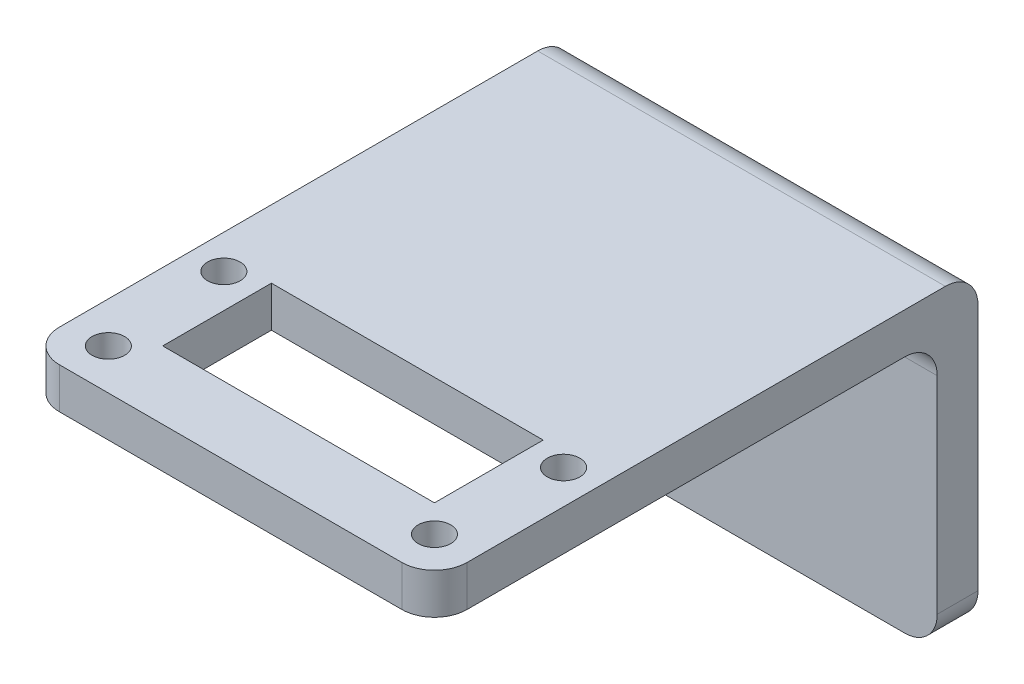
ISO-10303-21;
HEADER;
FILE_DESCRIPTION(('STEP AP214'),'2;1');
FILE_NAME('part.step','',(''),(''),'','','');
FILE_SCHEMA(('AUTOMOTIVE_DESIGN { 1 0 10303 214 1 1 1 1 }'));
ENDSEC;
DATA;
#1=APPLICATION_CONTEXT('core data for automotive mechanical design processes');
#2=APPLICATION_PROTOCOL_DEFINITION('international standard','automotive_design',2000,#1);
#3=PRODUCT_CONTEXT('',#1,'mechanical');
#4=PRODUCT('Part','Part','',(#3));
#5=PRODUCT_RELATED_PRODUCT_CATEGORY('part','',(#4));
#6=PRODUCT_DEFINITION_FORMATION('','',#4);
#7=PRODUCT_DEFINITION_CONTEXT('part definition',#1,'design');
#8=PRODUCT_DEFINITION('design','',#6,#7);
#9=PRODUCT_DEFINITION_SHAPE('','',#8);
#10=(LENGTH_UNIT() NAMED_UNIT(*) SI_UNIT(.MILLI.,.METRE.));
#11=(NAMED_UNIT(*) PLANE_ANGLE_UNIT() SI_UNIT($,.RADIAN.));
#12=(NAMED_UNIT(*) SI_UNIT($,.STERADIAN.) SOLID_ANGLE_UNIT());
#13=UNCERTAINTY_MEASURE_WITH_UNIT(LENGTH_MEASURE(1.E-05),#10,'distance_accuracy_value','');
#14=(GEOMETRIC_REPRESENTATION_CONTEXT(3) GLOBAL_UNCERTAINTY_ASSIGNED_CONTEXT((#13)) GLOBAL_UNIT_ASSIGNED_CONTEXT((#10,
#11,#12)) REPRESENTATION_CONTEXT('',''));
#15=CARTESIAN_POINT('',(0.,0.,0.));
#16=DIRECTION('',(0.,0.,1.));
#17=DIRECTION('',(1.,0.,0.));
#18=AXIS2_PLACEMENT_3D('',#15,#16,#17);
#19=CARTESIAN_POINT('',(0.,0.,0.));
#20=DIRECTION('',(0.,-1.,0.));
#21=DIRECTION('',(0.,0.,-1.));
#22=AXIS2_PLACEMENT_3D('',#19,#20,#21);
#23=PLANE('',#22);
#24=CARTESIAN_POINT('',(12.,0.,17.));
#25=DIRECTION('',(0.,-1.,0.));
#26=DIRECTION('',(0.,0.,-1.));
#27=AXIS2_PLACEMENT_3D('',#24,#25,#26);
#28=CIRCLE('',#27,1.2);
#29=CARTESIAN_POINT('',(12.,0.,15.8));
#30=VERTEX_POINT('',#29);
#31=EDGE_CURVE('E304',#30,#30,#28,.T.);
#32=ORIENTED_EDGE('',*,*,#31,.F.);
#33=EDGE_LOOP('',(#32));
#34=FACE_BOUND('',#33,.T.);
#35=CARTESIAN_POINT('',(-12.5,0.,8.));
#36=DIRECTION('',(0.,-1.,0.));
#37=DIRECTION('',(0.,0.,-1.));
#38=AXIS2_PLACEMENT_3D('',#35,#36,#37);
#39=CIRCLE('',#38,1.2);
#40=CARTESIAN_POINT('',(-12.5,0.,6.8));
#41=VERTEX_POINT('',#40);
#42=EDGE_CURVE('E298',#41,#41,#39,.T.);
#43=ORIENTED_EDGE('',*,*,#42,.F.);
#44=EDGE_LOOP('',(#43));
#45=FACE_BOUND('',#44,.T.);
#46=CARTESIAN_POINT('',(12.5,0.,8.));
#47=DIRECTION('',(0.,-1.,0.));
#48=DIRECTION('',(0.,0.,-1.));
#49=AXIS2_PLACEMENT_3D('',#46,#47,#48);
#50=CIRCLE('',#49,1.2);
#51=CARTESIAN_POINT('',(12.5,0.,6.8));
#52=VERTEX_POINT('',#51);
#53=EDGE_CURVE('E291',#52,#52,#50,.T.);
#54=ORIENTED_EDGE('',*,*,#53,.F.);
#55=EDGE_LOOP('',(#54));
#56=FACE_BOUND('',#55,.T.);
#57=CARTESIAN_POINT('',(-12.,0.,17.));
#58=DIRECTION('',(0.,-1.,0.));
#59=DIRECTION('',(0.,0.,-1.));
#60=AXIS2_PLACEMENT_3D('',#57,#58,#59);
#61=CIRCLE('',#60,1.2);
#62=CARTESIAN_POINT('',(-12.,0.,15.8));
#63=VERTEX_POINT('',#62);
#64=EDGE_CURVE('E183',#63,#63,#61,.T.);
#65=ORIENTED_EDGE('',*,*,#64,.F.);
#66=EDGE_LOOP('',(#65));
#67=FACE_BOUND('',#66,.T.);
#68=DIRECTION('',(0.,0.,-1.));
#69=VECTOR('',#68,1.);
#70=CARTESIAN_POINT('',(10.,0.,7.00000000000001));
#71=LINE('',#70,#69);
#72=CARTESIAN_POINT('',(10.,0.,15.));
#73=VERTEX_POINT('',#72);
#74=CARTESIAN_POINT('',(10.,0.,7.00000000000001));
#75=VERTEX_POINT('',#74);
#76=EDGE_CURVE('E157',#73,#75,#71,.T.);
#77=ORIENTED_EDGE('',*,*,#76,.T.);
#78=DIRECTION('',(-1.,0.,0.));
#79=VECTOR('',#78,1.);
#80=CARTESIAN_POINT('',(-10.,0.,7.00000000000001));
#81=LINE('',#80,#79);
#82=CARTESIAN_POINT('',(-10.,0.,7.00000000000001));
#83=VERTEX_POINT('',#82);
#84=EDGE_CURVE('E169',#75,#83,#81,.T.);
#85=ORIENTED_EDGE('',*,*,#84,.T.);
#86=DIRECTION('',(0.,0.,1.));
#87=VECTOR('',#86,1.);
#88=CARTESIAN_POINT('',(-10.,0.,15.));
#89=LINE('',#88,#87);
#90=CARTESIAN_POINT('',(-10.,0.,15.));
#91=VERTEX_POINT('',#90);
#92=EDGE_CURVE('E173',#83,#91,#89,.T.);
#93=ORIENTED_EDGE('',*,*,#92,.T.);
#94=DIRECTION('',(1.,0.,0.));
#95=VECTOR('',#94,1.);
#96=CARTESIAN_POINT('',(10.,0.,15.));
#97=LINE('',#96,#95);
#98=EDGE_CURVE('E165',#91,#73,#97,.T.);
#99=ORIENTED_EDGE('',*,*,#98,.T.);
#100=EDGE_LOOP('',(#77,#85,#93,#99));
#101=FACE_BOUND('',#100,.T.);
#102=DIRECTION('',(0.,0.,-1.));
#103=VECTOR('',#102,1.);
#104=CARTESIAN_POINT('',(15.,0.,20.));
#105=LINE('',#104,#103);
#106=CARTESIAN_POINT('',(15.,0.,17.6));
#107=VERTEX_POINT('',#106);
#108=CARTESIAN_POINT('',(15.,0.,-14.6));
#109=VERTEX_POINT('',#108);
#110=EDGE_CURVE('E196',#107,#109,#105,.T.);
#111=ORIENTED_EDGE('',*,*,#110,.F.);
#112=CARTESIAN_POINT('',(12.6,0.,17.6));
#113=DIRECTION('',(0.,-1.,0.));
#114=DIRECTION('',(0.,0.,-1.));
#115=AXIS2_PLACEMENT_3D('',#112,#113,#114);
#116=CIRCLE('',#115,2.4);
#117=CARTESIAN_POINT('',(12.6,0.,20.));
#118=VERTEX_POINT('',#117);
#119=EDGE_CURVE('E245',#107,#118,#116,.T.);
#120=ORIENTED_EDGE('',*,*,#119,.T.);
#121=DIRECTION('',(1.,0.,0.));
#122=VECTOR('',#121,1.);
#123=CARTESIAN_POINT('',(-15.,0.,20.));
#124=LINE('',#123,#122);
#125=CARTESIAN_POINT('',(-12.6,0.,20.));
#126=VERTEX_POINT('',#125);
#127=EDGE_CURVE('E203',#126,#118,#124,.T.);
#128=ORIENTED_EDGE('',*,*,#127,.F.);
#129=CARTESIAN_POINT('',(-12.6,0.,17.6));
#130=DIRECTION('',(0.,-1.,0.));
#131=DIRECTION('',(0.,0.,-1.));
#132=AXIS2_PLACEMENT_3D('',#129,#130,#131);
#133=CIRCLE('',#132,2.4);
#134=CARTESIAN_POINT('',(-15.,0.,17.6));
#135=VERTEX_POINT('',#134);
#136=EDGE_CURVE('E243',#126,#135,#133,.T.);
#137=ORIENTED_EDGE('',*,*,#136,.T.);
#138=DIRECTION('',(0.,0.,1.));
#139=VECTOR('',#138,1.);
#140=CARTESIAN_POINT('',(-15.,0.,-20.));
#141=LINE('',#140,#139);
#142=CARTESIAN_POINT('',(-15.,0.,-14.6));
#143=VERTEX_POINT('',#142);
#144=EDGE_CURVE('E211',#143,#135,#141,.T.);
#145=ORIENTED_EDGE('',*,*,#144,.F.);
#146=DIRECTION('',(1.,0.,0.));
#147=VECTOR('',#146,1.);
#148=CARTESIAN_POINT('',(15.,0.,-14.6));
#149=LINE('',#148,#147);
#150=EDGE_CURVE('E219',#143,#109,#149,.T.);
#151=ORIENTED_EDGE('',*,*,#150,.T.);
#152=EDGE_LOOP('',(#111,#120,#128,#137,#145,#151));
#153=FACE_BOUND('',#152,.T.);
#154=ADVANCED_FACE('F38',(#34,#45,#56,#67,#101,#153),#23,.T.);
#155=CARTESIAN_POINT('',(15.,3.,20.));
#156=DIRECTION('',(-1.,0.,0.));
#157=DIRECTION('',(0.,0.,1.));
#158=AXIS2_PLACEMENT_3D('',#155,#156,#157);
#159=PLANE('',#158);
#160=DIRECTION('',(0.,1.,0.));
#161=VECTOR('',#160,1.);
#162=CARTESIAN_POINT('',(15.,-20.,-17.));
#163=LINE('',#162,#161);
#164=CARTESIAN_POINT('',(15.,-17.6,-17.));
#165=VERTEX_POINT('',#164);
#166=CARTESIAN_POINT('',(15.,-2.4,-17.));
#167=VERTEX_POINT('',#166);
#168=EDGE_CURVE('E280',#165,#167,#163,.T.);
#169=ORIENTED_EDGE('',*,*,#168,.F.);
#170=DIRECTION('',(0.,0.,1.));
#171=VECTOR('',#170,1.);
#172=CARTESIAN_POINT('',(15.,-17.6,-20.));
#173=LINE('',#172,#171);
#174=CARTESIAN_POINT('',(15.,-17.6,-20.));
#175=VERTEX_POINT('',#174);
#176=EDGE_CURVE('E61',#165,#175,#173,.F.);
#177=ORIENTED_EDGE('',*,*,#176,.T.);
#178=DIRECTION('',(0.,-1.,0.));
#179=VECTOR('',#178,1.);
#180=CARTESIAN_POINT('',(15.,3.,-20.));
#181=LINE('',#180,#179);
#182=CARTESIAN_POINT('',(15.,0.6,-20.));
#183=VERTEX_POINT('',#182);
#184=EDGE_CURVE('E217',#183,#175,#181,.T.);
#185=ORIENTED_EDGE('',*,*,#184,.F.);
#186=CARTESIAN_POINT('',(15.,0.6,-17.6));
#187=DIRECTION('',(-1.,0.,0.));
#188=DIRECTION('',(0.,0.,1.));
#189=AXIS2_PLACEMENT_3D('',#186,#187,#188);
#190=CIRCLE('',#189,2.4);
#191=CARTESIAN_POINT('',(15.,3.,-17.6));
#192=VERTEX_POINT('',#191);
#193=EDGE_CURVE('E237',#183,#192,#190,.F.);
#194=ORIENTED_EDGE('',*,*,#193,.T.);
#195=DIRECTION('',(0.,0.,-1.));
#196=VECTOR('',#195,1.);
#197=CARTESIAN_POINT('',(15.,3.,20.));
#198=LINE('',#197,#196);
#199=CARTESIAN_POINT('',(15.,3.,17.6));
#200=VERTEX_POINT('',#199);
#201=EDGE_CURVE('E200',#200,#192,#198,.T.);
#202=ORIENTED_EDGE('',*,*,#201,.F.);
#203=DIRECTION('',(0.,-1.,0.));
#204=VECTOR('',#203,1.);
#205=CARTESIAN_POINT('',(15.,3.,17.6));
#206=LINE('',#205,#204);
#207=EDGE_CURVE('E240',#200,#107,#206,.T.);
#208=ORIENTED_EDGE('',*,*,#207,.T.);
#209=ORIENTED_EDGE('',*,*,#110,.T.);
#210=CARTESIAN_POINT('',(15.,-2.4,-14.6));
#211=DIRECTION('',(-1.,0.,0.));
#212=DIRECTION('',(0.,0.,1.));
#213=AXIS2_PLACEMENT_3D('',#210,#211,#212);
#214=CIRCLE('',#213,2.4);
#215=EDGE_CURVE('E225',#109,#167,#214,.T.);
#216=ORIENTED_EDGE('',*,*,#215,.T.);
#217=EDGE_LOOP('',(#169,#177,#185,#194,#202,#208,#209,#216));
#218=FACE_BOUND('',#217,.T.);
#219=ADVANCED_FACE('F286',(#218),#159,.F.);
#220=CARTESIAN_POINT('',(-15.,3.,-20.));
#221=DIRECTION('',(0.,0.,1.));
#222=DIRECTION('',(1.,0.,0.));
#223=AXIS2_PLACEMENT_3D('',#220,#221,#222);
#224=PLANE('',#223);
#225=ORIENTED_EDGE('',*,*,#184,.T.);
#226=CARTESIAN_POINT('',(12.6,-17.6,-20.));
#227=DIRECTION('',(0.,0.,1.));
#228=DIRECTION('',(1.,0.,0.));
#229=AXIS2_PLACEMENT_3D('',#226,#227,#228);
#230=CIRCLE('',#229,2.4);
#231=CARTESIAN_POINT('',(12.6,-20.,-20.));
#232=VERTEX_POINT('',#231);
#233=EDGE_CURVE('E46',#175,#232,#230,.F.);
#234=ORIENTED_EDGE('',*,*,#233,.T.);
#235=DIRECTION('',(1.,0.,0.));
#236=VECTOR('',#235,1.);
#237=CARTESIAN_POINT('',(0.,-20.,-20.));
#238=LINE('',#237,#236);
#239=CARTESIAN_POINT('',(-12.6,-20.,-20.));
#240=VERTEX_POINT('',#239);
#241=EDGE_CURVE('E272',#240,#232,#238,.T.);
#242=ORIENTED_EDGE('',*,*,#241,.F.);
#243=CARTESIAN_POINT('',(-12.6,-17.6,-20.));
#244=DIRECTION('',(0.,0.,1.));
#245=DIRECTION('',(1.,0.,0.));
#246=AXIS2_PLACEMENT_3D('',#243,#244,#245);
#247=CIRCLE('',#246,2.4);
#248=CARTESIAN_POINT('',(-15.,-17.6,-20.));
#249=VERTEX_POINT('',#248);
#250=EDGE_CURVE('E53',#240,#249,#247,.F.);
#251=ORIENTED_EDGE('',*,*,#250,.T.);
#252=DIRECTION('',(0.,-1.,0.));
#253=VECTOR('',#252,1.);
#254=CARTESIAN_POINT('',(-15.,3.,-20.));
#255=LINE('',#254,#253);
#256=CARTESIAN_POINT('',(-15.,0.6,-20.));
#257=VERTEX_POINT('',#256);
#258=EDGE_CURVE('E209',#257,#249,#255,.T.);
#259=ORIENTED_EDGE('',*,*,#258,.F.);
#260=DIRECTION('',(-1.,0.,0.));
#261=VECTOR('',#260,1.);
#262=CARTESIAN_POINT('',(-15.,0.6,-20.));
#263=LINE('',#262,#261);
#264=EDGE_CURVE('E235',#257,#183,#263,.F.);
#265=ORIENTED_EDGE('',*,*,#264,.T.);
#266=EDGE_LOOP('',(#225,#234,#242,#251,#259,#265));
#267=FACE_BOUND('',#266,.T.);
#268=ADVANCED_FACE('F271',(#267),#224,.F.);
#269=CARTESIAN_POINT('',(-15.,3.,-20.));
#270=DIRECTION('',(1.,0.,0.));
#271=DIRECTION('',(0.,0.,-1.));
#272=AXIS2_PLACEMENT_3D('',#269,#270,#271);
#273=PLANE('',#272);
#274=ORIENTED_EDGE('',*,*,#258,.T.);
#275=DIRECTION('',(0.,0.,-1.));
#276=VECTOR('',#275,1.);
#277=CARTESIAN_POINT('',(-15.,-17.6,-17.));
#278=LINE('',#277,#276);
#279=CARTESIAN_POINT('',(-15.,-17.6,-17.));
#280=VERTEX_POINT('',#279);
#281=EDGE_CURVE('E11',#249,#280,#278,.F.);
#282=ORIENTED_EDGE('',*,*,#281,.T.);
#283=DIRECTION('',(0.,1.,0.));
#284=VECTOR('',#283,1.);
#285=CARTESIAN_POINT('',(-15.,-20.,-17.));
#286=LINE('',#285,#284);
#287=CARTESIAN_POINT('',(-15.,-2.4,-17.));
#288=VERTEX_POINT('',#287);
#289=EDGE_CURVE('E289',#280,#288,#286,.T.);
#290=ORIENTED_EDGE('',*,*,#289,.T.);
#291=CARTESIAN_POINT('',(-15.,-2.4,-14.6));
#292=DIRECTION('',(1.,0.,0.));
#293=DIRECTION('',(0.,0.,-1.));
#294=AXIS2_PLACEMENT_3D('',#291,#292,#293);
#295=CIRCLE('',#294,2.4);
#296=EDGE_CURVE('E228',#288,#143,#295,.T.);
#297=ORIENTED_EDGE('',*,*,#296,.T.);
#298=ORIENTED_EDGE('',*,*,#144,.T.);
#299=DIRECTION('',(0.,-1.,0.));
#300=VECTOR('',#299,1.);
#301=CARTESIAN_POINT('',(-15.,3.,17.6));
#302=LINE('',#301,#300);
#303=CARTESIAN_POINT('',(-15.,3.,17.6));
#304=VERTEX_POINT('',#303);
#305=EDGE_CURVE('E256',#135,#304,#302,.F.);
#306=ORIENTED_EDGE('',*,*,#305,.T.);
#307=DIRECTION('',(0.,0.,1.));
#308=VECTOR('',#307,1.);
#309=CARTESIAN_POINT('',(-15.,3.,-20.));
#310=LINE('',#309,#308);
#311=CARTESIAN_POINT('',(-15.,3.,-17.6));
#312=VERTEX_POINT('',#311);
#313=EDGE_CURVE('E202',#312,#304,#310,.T.);
#314=ORIENTED_EDGE('',*,*,#313,.F.);
#315=CARTESIAN_POINT('',(-15.,0.6,-17.6));
#316=DIRECTION('',(1.,0.,0.));
#317=DIRECTION('',(0.,0.,-1.));
#318=AXIS2_PLACEMENT_3D('',#315,#316,#317);
#319=CIRCLE('',#318,2.4);
#320=EDGE_CURVE('E233',#312,#257,#319,.F.);
#321=ORIENTED_EDGE('',*,*,#320,.T.);
#322=EDGE_LOOP('',(#274,#282,#290,#297,#298,#306,#314,#321));
#323=FACE_BOUND('',#322,.T.);
#324=ADVANCED_FACE('F335',(#323),#273,.F.);
#325=CARTESIAN_POINT('',(-15.,3.,20.));
#326=DIRECTION('',(0.,0.,-1.));
#327=DIRECTION('',(-1.,0.,0.));
#328=AXIS2_PLACEMENT_3D('',#325,#326,#327);
#329=PLANE('',#328);
#330=ORIENTED_EDGE('',*,*,#127,.T.);
#331=DIRECTION('',(0.,-1.,0.));
#332=VECTOR('',#331,1.);
#333=CARTESIAN_POINT('',(12.6,3.,20.));
#334=LINE('',#333,#332);
#335=CARTESIAN_POINT('',(12.6,3.,20.));
#336=VERTEX_POINT('',#335);
#337=EDGE_CURVE('E250',#118,#336,#334,.F.);
#338=ORIENTED_EDGE('',*,*,#337,.T.);
#339=DIRECTION('',(1.,0.,0.));
#340=VECTOR('',#339,1.);
#341=CARTESIAN_POINT('',(-15.,3.,20.));
#342=LINE('',#341,#340);
#343=CARTESIAN_POINT('',(-12.6,3.,20.));
#344=VERTEX_POINT('',#343);
#345=EDGE_CURVE('E206',#344,#336,#342,.T.);
#346=ORIENTED_EDGE('',*,*,#345,.F.);
#347=DIRECTION('',(0.,-1.,0.));
#348=VECTOR('',#347,1.);
#349=CARTESIAN_POINT('',(-12.6,3.,20.));
#350=LINE('',#349,#348);
#351=EDGE_CURVE('E247',#344,#126,#350,.T.);
#352=ORIENTED_EDGE('',*,*,#351,.T.);
#353=EDGE_LOOP('',(#330,#338,#346,#352));
#354=FACE_BOUND('',#353,.T.);
#355=ADVANCED_FACE('F332',(#354),#329,.F.);
#356=CARTESIAN_POINT('',(0.,3.,0.));
#357=DIRECTION('',(0.,-1.,0.));
#358=DIRECTION('',(0.,0.,-1.));
#359=AXIS2_PLACEMENT_3D('',#356,#357,#358);
#360=PLANE('',#359);
#361=CARTESIAN_POINT('',(12.,3.,17.));
#362=DIRECTION('',(0.,-1.,0.));
#363=DIRECTION('',(0.,0.,-1.));
#364=AXIS2_PLACEMENT_3D('',#361,#362,#363);
#365=CIRCLE('',#364,1.2);
#366=CARTESIAN_POINT('',(12.,3.,15.8));
#367=VERTEX_POINT('',#366);
#368=EDGE_CURVE('E301',#367,#367,#365,.T.);
#369=ORIENTED_EDGE('',*,*,#368,.T.);
#370=EDGE_LOOP('',(#369));
#371=FACE_BOUND('',#370,.T.);
#372=CARTESIAN_POINT('',(-12.5,3.,8.));
#373=DIRECTION('',(0.,-1.,0.));
#374=DIRECTION('',(0.,0.,-1.));
#375=AXIS2_PLACEMENT_3D('',#372,#373,#374);
#376=CIRCLE('',#375,1.2);
#377=CARTESIAN_POINT('',(-12.5,3.,6.8));
#378=VERTEX_POINT('',#377);
#379=EDGE_CURVE('E307',#378,#378,#376,.T.);
#380=ORIENTED_EDGE('',*,*,#379,.T.);
#381=EDGE_LOOP('',(#380));
#382=FACE_BOUND('',#381,.T.);
#383=CARTESIAN_POINT('',(12.5,3.,8.));
#384=DIRECTION('',(0.,-1.,0.));
#385=DIRECTION('',(0.,0.,-1.));
#386=AXIS2_PLACEMENT_3D('',#383,#384,#385);
#387=CIRCLE('',#386,1.2);
#388=CARTESIAN_POINT('',(12.5,3.,6.8));
#389=VERTEX_POINT('',#388);
#390=EDGE_CURVE('E295',#389,#389,#387,.T.);
#391=ORIENTED_EDGE('',*,*,#390,.T.);
#392=EDGE_LOOP('',(#391));
#393=FACE_BOUND('',#392,.T.);
#394=CARTESIAN_POINT('',(-12.,3.,17.));
#395=DIRECTION('',(0.,-1.,0.));
#396=DIRECTION('',(0.,0.,-1.));
#397=AXIS2_PLACEMENT_3D('',#394,#395,#396);
#398=CIRCLE('',#397,1.2);
#399=CARTESIAN_POINT('',(-12.,3.,15.8));
#400=VERTEX_POINT('',#399);
#401=EDGE_CURVE('E190',#400,#400,#398,.T.);
#402=ORIENTED_EDGE('',*,*,#401,.T.);
#403=EDGE_LOOP('',(#402));
#404=FACE_BOUND('',#403,.T.);
#405=DIRECTION('',(-1.,0.,0.));
#406=VECTOR('',#405,1.);
#407=CARTESIAN_POINT('',(-10.,3.,7.00000000000001));
#408=LINE('',#407,#406);
#409=CARTESIAN_POINT('',(10.,3.,7.00000000000001));
#410=VERTEX_POINT('',#409);
#411=CARTESIAN_POINT('',(-10.,3.,7.00000000000001));
#412=VERTEX_POINT('',#411);
#413=EDGE_CURVE('E189',#410,#412,#408,.T.);
#414=ORIENTED_EDGE('',*,*,#413,.F.);
#415=DIRECTION('',(0.,0.,-1.));
#416=VECTOR('',#415,1.);
#417=CARTESIAN_POINT('',(10.,3.,7.00000000000001));
#418=LINE('',#417,#416);
#419=CARTESIAN_POINT('',(10.,3.,15.));
#420=VERTEX_POINT('',#419);
#421=EDGE_CURVE('E160',#420,#410,#418,.T.);
#422=ORIENTED_EDGE('',*,*,#421,.F.);
#423=DIRECTION('',(1.,0.,0.));
#424=VECTOR('',#423,1.);
#425=CARTESIAN_POINT('',(10.,3.,15.));
#426=LINE('',#425,#424);
#427=CARTESIAN_POINT('',(-10.,3.,15.));
#428=VERTEX_POINT('',#427);
#429=EDGE_CURVE('E177',#428,#420,#426,.T.);
#430=ORIENTED_EDGE('',*,*,#429,.F.);
#431=DIRECTION('',(0.,0.,1.));
#432=VECTOR('',#431,1.);
#433=CARTESIAN_POINT('',(-10.,3.,15.));
#434=LINE('',#433,#432);
#435=EDGE_CURVE('E180',#412,#428,#434,.T.);
#436=ORIENTED_EDGE('',*,*,#435,.F.);
#437=EDGE_LOOP('',(#414,#422,#430,#436));
#438=FACE_BOUND('',#437,.T.);
#439=ORIENTED_EDGE('',*,*,#345,.T.);
#440=CARTESIAN_POINT('',(12.6,3.,17.6));
#441=DIRECTION('',(0.,-1.,0.));
#442=DIRECTION('',(0.,0.,-1.));
#443=AXIS2_PLACEMENT_3D('',#440,#441,#442);
#444=CIRCLE('',#443,2.4);
#445=EDGE_CURVE('E254',#336,#200,#444,.F.);
#446=ORIENTED_EDGE('',*,*,#445,.T.);
#447=ORIENTED_EDGE('',*,*,#201,.T.);
#448=DIRECTION('',(-1.,0.,0.));
#449=VECTOR('',#448,1.);
#450=CARTESIAN_POINT('',(0.,3.,-17.6));
#451=LINE('',#450,#449);
#452=EDGE_CURVE('E230',#192,#312,#451,.T.);
#453=ORIENTED_EDGE('',*,*,#452,.T.);
#454=ORIENTED_EDGE('',*,*,#313,.T.);
#455=CARTESIAN_POINT('',(-12.6,3.,17.6));
#456=DIRECTION('',(0.,-1.,0.));
#457=DIRECTION('',(0.,0.,-1.));
#458=AXIS2_PLACEMENT_3D('',#455,#456,#457);
#459=CIRCLE('',#458,2.4);
#460=EDGE_CURVE('E252',#304,#344,#459,.F.);
#461=ORIENTED_EDGE('',*,*,#460,.T.);
#462=EDGE_LOOP('',(#439,#446,#447,#453,#454,#461));
#463=FACE_BOUND('',#462,.T.);
#464=ADVANCED_FACE('F330',(#371,#382,#393,#404,#438,#463),#360,.F.);
#465=CARTESIAN_POINT('',(10.,0.,7.00000000000001));
#466=DIRECTION('',(1.,0.,0.));
#467=DIRECTION('',(0.,0.,-1.));
#468=AXIS2_PLACEMENT_3D('',#465,#466,#467);
#469=PLANE('',#468);
#470=ORIENTED_EDGE('',*,*,#421,.T.);
#471=DIRECTION('',(0.,1.,0.));
#472=VECTOR('',#471,1.);
#473=CARTESIAN_POINT('',(10.,0.,7.00000000000001));
#474=LINE('',#473,#472);
#475=EDGE_CURVE('E153',#75,#410,#474,.T.);
#476=ORIENTED_EDGE('',*,*,#475,.F.);
#477=ORIENTED_EDGE('',*,*,#76,.F.);
#478=DIRECTION('',(0.,1.,0.));
#479=VECTOR('',#478,1.);
#480=CARTESIAN_POINT('',(10.,0.,15.));
#481=LINE('',#480,#479);
#482=EDGE_CURVE('E194',#73,#420,#481,.T.);
#483=ORIENTED_EDGE('',*,*,#482,.T.);
#484=EDGE_LOOP('',(#470,#476,#477,#483));
#485=FACE_BOUND('',#484,.T.);
#486=ADVANCED_FACE('F155',(#485),#469,.F.);
#487=CARTESIAN_POINT('',(10.,0.,15.));
#488=DIRECTION('',(0.,0.,1.));
#489=DIRECTION('',(1.,0.,0.));
#490=AXIS2_PLACEMENT_3D('',#487,#488,#489);
#491=PLANE('',#490);
#492=ORIENTED_EDGE('',*,*,#429,.T.);
#493=ORIENTED_EDGE('',*,*,#482,.F.);
#494=ORIENTED_EDGE('',*,*,#98,.F.);
#495=DIRECTION('',(0.,1.,0.));
#496=VECTOR('',#495,1.);
#497=CARTESIAN_POINT('',(-10.,0.,15.));
#498=LINE('',#497,#496);
#499=EDGE_CURVE('E197',#91,#428,#498,.T.);
#500=ORIENTED_EDGE('',*,*,#499,.T.);
#501=EDGE_LOOP('',(#492,#493,#494,#500));
#502=FACE_BOUND('',#501,.T.);
#503=ADVANCED_FACE('F390',(#502),#491,.F.);
#504=CARTESIAN_POINT('',(-10.,0.,15.));
#505=DIRECTION('',(-1.,0.,0.));
#506=DIRECTION('',(0.,0.,1.));
#507=AXIS2_PLACEMENT_3D('',#504,#505,#506);
#508=PLANE('',#507);
#509=ORIENTED_EDGE('',*,*,#435,.T.);
#510=ORIENTED_EDGE('',*,*,#499,.F.);
#511=ORIENTED_EDGE('',*,*,#92,.F.);
#512=DIRECTION('',(0.,1.,0.));
#513=VECTOR('',#512,1.);
#514=CARTESIAN_POINT('',(-10.,0.,7.00000000000001));
#515=LINE('',#514,#513);
#516=EDGE_CURVE('E164',#83,#412,#515,.T.);
#517=ORIENTED_EDGE('',*,*,#516,.T.);
#518=EDGE_LOOP('',(#509,#510,#511,#517));
#519=FACE_BOUND('',#518,.T.);
#520=ADVANCED_FACE('F400',(#519),#508,.F.);
#521=CARTESIAN_POINT('',(-10.,0.,7.00000000000001));
#522=DIRECTION('',(0.,0.,-1.));
#523=DIRECTION('',(-1.,0.,0.));
#524=AXIS2_PLACEMENT_3D('',#521,#522,#523);
#525=PLANE('',#524);
#526=ORIENTED_EDGE('',*,*,#413,.T.);
#527=ORIENTED_EDGE('',*,*,#516,.F.);
#528=ORIENTED_EDGE('',*,*,#84,.F.);
#529=ORIENTED_EDGE('',*,*,#475,.T.);
#530=EDGE_LOOP('',(#526,#527,#528,#529));
#531=FACE_BOUND('',#530,.T.);
#532=ADVANCED_FACE('F170',(#531),#525,.F.);
#533=CARTESIAN_POINT('',(-12.,3.,17.));
#534=DIRECTION('',(0.,-1.,0.));
#535=DIRECTION('',(0.,0.,-1.));
#536=AXIS2_PLACEMENT_3D('',#533,#534,#535);
#537=CYLINDRICAL_SURFACE('',#536,1.2);
#538=ORIENTED_EDGE('',*,*,#401,.F.);
#539=EDGE_LOOP('',(#538));
#540=FACE_BOUND('',#539,.T.);
#541=ORIENTED_EDGE('',*,*,#64,.T.);
#542=EDGE_LOOP('',(#541));
#543=FACE_BOUND('',#542,.T.);
#544=ADVANCED_FACE('F317',(#540,#543),#537,.F.);
#545=CARTESIAN_POINT('',(12.5,3.,8.));
#546=DIRECTION('',(0.,-1.,0.));
#547=DIRECTION('',(0.,0.,-1.));
#548=AXIS2_PLACEMENT_3D('',#545,#546,#547);
#549=CYLINDRICAL_SURFACE('',#548,1.2);
#550=ORIENTED_EDGE('',*,*,#390,.F.);
#551=EDGE_LOOP('',(#550));
#552=FACE_BOUND('',#551,.T.);
#553=ORIENTED_EDGE('',*,*,#53,.T.);
#554=EDGE_LOOP('',(#553));
#555=FACE_BOUND('',#554,.T.);
#556=ADVANCED_FACE('F415',(#552,#555),#549,.F.);
#557=CARTESIAN_POINT('',(-12.5,3.,8.));
#558=DIRECTION('',(0.,-1.,0.));
#559=DIRECTION('',(0.,0.,-1.));
#560=AXIS2_PLACEMENT_3D('',#557,#558,#559);
#561=CYLINDRICAL_SURFACE('',#560,1.2);
#562=ORIENTED_EDGE('',*,*,#379,.F.);
#563=EDGE_LOOP('',(#562));
#564=FACE_BOUND('',#563,.T.);
#565=ORIENTED_EDGE('',*,*,#42,.T.);
#566=EDGE_LOOP('',(#565));
#567=FACE_BOUND('',#566,.T.);
#568=ADVANCED_FACE('F420',(#564,#567),#561,.F.);
#569=CARTESIAN_POINT('',(12.,3.,17.));
#570=DIRECTION('',(0.,-1.,0.));
#571=DIRECTION('',(0.,0.,-1.));
#572=AXIS2_PLACEMENT_3D('',#569,#570,#571);
#573=CYLINDRICAL_SURFACE('',#572,1.2);
#574=ORIENTED_EDGE('',*,*,#368,.F.);
#575=EDGE_LOOP('',(#574));
#576=FACE_BOUND('',#575,.T.);
#577=ORIENTED_EDGE('',*,*,#31,.T.);
#578=EDGE_LOOP('',(#577));
#579=FACE_BOUND('',#578,.T.);
#580=ADVANCED_FACE('F426',(#576,#579),#573,.F.);
#581=CARTESIAN_POINT('',(0.,-20.,-17.));
#582=DIRECTION('',(0.,0.,1.));
#583=DIRECTION('',(1.,0.,0.));
#584=AXIS2_PLACEMENT_3D('',#581,#582,#583);
#585=PLANE('',#584);
#586=DIRECTION('',(1.,0.,0.));
#587=VECTOR('',#586,1.);
#588=CARTESIAN_POINT('',(0.,-20.,-17.));
#589=LINE('',#588,#587);
#590=CARTESIAN_POINT('',(-12.6,-20.,-17.));
#591=VERTEX_POINT('',#590);
#592=CARTESIAN_POINT('',(12.6,-20.,-17.));
#593=VERTEX_POINT('',#592);
#594=EDGE_CURVE('E281',#591,#593,#589,.T.);
#595=ORIENTED_EDGE('',*,*,#594,.T.);
#596=CARTESIAN_POINT('',(12.6,-17.6,-17.));
#597=DIRECTION('',(0.,0.,1.));
#598=DIRECTION('',(1.,0.,0.));
#599=AXIS2_PLACEMENT_3D('',#596,#597,#598);
#600=CIRCLE('',#599,2.4);
#601=EDGE_CURVE('E266',#593,#165,#600,.T.);
#602=ORIENTED_EDGE('',*,*,#601,.T.);
#603=ORIENTED_EDGE('',*,*,#168,.T.);
#604=DIRECTION('',(1.,0.,0.));
#605=VECTOR('',#604,1.);
#606=CARTESIAN_POINT('',(-15.,-2.4,-17.));
#607=LINE('',#606,#605);
#608=EDGE_CURVE('E222',#167,#288,#607,.F.);
#609=ORIENTED_EDGE('',*,*,#608,.T.);
#610=ORIENTED_EDGE('',*,*,#289,.F.);
#611=CARTESIAN_POINT('',(-12.6,-17.6,-17.));
#612=DIRECTION('',(0.,0.,1.));
#613=DIRECTION('',(1.,0.,0.));
#614=AXIS2_PLACEMENT_3D('',#611,#612,#613);
#615=CIRCLE('',#614,2.4);
#616=EDGE_CURVE('E264',#280,#591,#615,.T.);
#617=ORIENTED_EDGE('',*,*,#616,.T.);
#618=EDGE_LOOP('',(#595,#602,#603,#609,#610,#617));
#619=FACE_BOUND('',#618,.T.);
#620=ADVANCED_FACE('F285',(#619),#585,.T.);
#621=CARTESIAN_POINT('',(0.,-20.,0.));
#622=DIRECTION('',(0.,-1.,0.));
#623=DIRECTION('',(0.,0.,-1.));
#624=AXIS2_PLACEMENT_3D('',#621,#622,#623);
#625=PLANE('',#624);
#626=ORIENTED_EDGE('',*,*,#241,.T.);
#627=DIRECTION('',(0.,0.,1.));
#628=VECTOR('',#627,1.);
#629=CARTESIAN_POINT('',(12.6,-20.,-17.));
#630=LINE('',#629,#628);
#631=EDGE_CURVE('E261',#232,#593,#630,.T.);
#632=ORIENTED_EDGE('',*,*,#631,.T.);
#633=ORIENTED_EDGE('',*,*,#594,.F.);
#634=DIRECTION('',(0.,0.,-1.));
#635=VECTOR('',#634,1.);
#636=CARTESIAN_POINT('',(-12.6,-20.,-20.));
#637=LINE('',#636,#635);
#638=EDGE_CURVE('E258',#591,#240,#637,.T.);
#639=ORIENTED_EDGE('',*,*,#638,.T.);
#640=EDGE_LOOP('',(#626,#632,#633,#639));
#641=FACE_BOUND('',#640,.T.);
#642=ADVANCED_FACE('F276',(#641),#625,.T.);
#643=CARTESIAN_POINT('',(0.,-2.4,-14.6));
#644=DIRECTION('',(-1.,0.,0.));
#645=DIRECTION('',(0.,0.,1.));
#646=AXIS2_PLACEMENT_3D('',#643,#644,#645);
#647=CYLINDRICAL_SURFACE('',#646,2.4);
#648=ORIENTED_EDGE('',*,*,#296,.F.);
#649=ORIENTED_EDGE('',*,*,#608,.F.);
#650=ORIENTED_EDGE('',*,*,#215,.F.);
#651=ORIENTED_EDGE('',*,*,#150,.F.);
#652=EDGE_LOOP('',(#648,#649,#650,#651));
#653=FACE_BOUND('',#652,.T.);
#654=ADVANCED_FACE('F342',(#653),#647,.F.);
#655=CARTESIAN_POINT('',(0.,0.6,-17.6));
#656=DIRECTION('',(-1.,0.,0.));
#657=DIRECTION('',(0.,0.,1.));
#658=AXIS2_PLACEMENT_3D('',#655,#656,#657);
#659=CYLINDRICAL_SURFACE('',#658,2.4);
#660=ORIENTED_EDGE('',*,*,#193,.F.);
#661=ORIENTED_EDGE('',*,*,#264,.F.);
#662=ORIENTED_EDGE('',*,*,#320,.F.);
#663=ORIENTED_EDGE('',*,*,#452,.F.);
#664=EDGE_LOOP('',(#660,#661,#662,#663));
#665=FACE_BOUND('',#664,.T.);
#666=ADVANCED_FACE('F345',(#665),#659,.T.);
#667=CARTESIAN_POINT('',(12.6,3.,17.6));
#668=DIRECTION('',(0.,-1.,0.));
#669=DIRECTION('',(0.,0.,-1.));
#670=AXIS2_PLACEMENT_3D('',#667,#668,#669);
#671=CYLINDRICAL_SURFACE('',#670,2.4);
#672=ORIENTED_EDGE('',*,*,#445,.F.);
#673=ORIENTED_EDGE('',*,*,#337,.F.);
#674=ORIENTED_EDGE('',*,*,#119,.F.);
#675=ORIENTED_EDGE('',*,*,#207,.F.);
#676=EDGE_LOOP('',(#672,#673,#674,#675));
#677=FACE_BOUND('',#676,.T.);
#678=ADVANCED_FACE('F349',(#677),#671,.T.);
#679=CARTESIAN_POINT('',(-12.6,3.,17.6));
#680=DIRECTION('',(0.,-1.,0.));
#681=DIRECTION('',(0.,0.,-1.));
#682=AXIS2_PLACEMENT_3D('',#679,#680,#681);
#683=CYLINDRICAL_SURFACE('',#682,2.4);
#684=ORIENTED_EDGE('',*,*,#460,.F.);
#685=ORIENTED_EDGE('',*,*,#305,.F.);
#686=ORIENTED_EDGE('',*,*,#136,.F.);
#687=ORIENTED_EDGE('',*,*,#351,.F.);
#688=EDGE_LOOP('',(#684,#685,#686,#687));
#689=FACE_BOUND('',#688,.T.);
#690=ADVANCED_FACE('F353',(#689),#683,.T.);
#691=CARTESIAN_POINT('',(12.6,-17.6,0.));
#692=DIRECTION('',(0.,0.,-1.));
#693=DIRECTION('',(-1.,0.,0.));
#694=AXIS2_PLACEMENT_3D('',#691,#692,#693);
#695=CYLINDRICAL_SURFACE('',#694,2.4);
#696=ORIENTED_EDGE('',*,*,#233,.F.);
#697=ORIENTED_EDGE('',*,*,#176,.F.);
#698=ORIENTED_EDGE('',*,*,#601,.F.);
#699=ORIENTED_EDGE('',*,*,#631,.F.);
#700=EDGE_LOOP('',(#696,#697,#698,#699));
#701=FACE_BOUND('',#700,.T.);
#702=ADVANCED_FACE('F283',(#701),#695,.T.);
#703=CARTESIAN_POINT('',(-12.6,-17.6,0.));
#704=DIRECTION('',(0.,0.,1.));
#705=DIRECTION('',(1.,0.,0.));
#706=AXIS2_PLACEMENT_3D('',#703,#704,#705);
#707=CYLINDRICAL_SURFACE('',#706,2.4);
#708=ORIENTED_EDGE('',*,*,#616,.F.);
#709=ORIENTED_EDGE('',*,*,#281,.F.);
#710=ORIENTED_EDGE('',*,*,#250,.F.);
#711=ORIENTED_EDGE('',*,*,#638,.F.);
#712=EDGE_LOOP('',(#708,#709,#710,#711));
#713=FACE_BOUND('',#712,.T.);
#714=ADVANCED_FACE('F40',(#713),#707,.T.);
#715=CLOSED_SHELL('',(#154,#219,#268,#324,#355,#464,#486,#503,#520,#532,#544,#556,#568,#580,
#620,#642,#654,#666,#678,#690,#702,#714));
#716=MANIFOLD_SOLID_BREP('B2',#715);
#717=ADVANCED_BREP_SHAPE_REPRESENTATION('',(#18,#716),#14);
#718=SHAPE_DEFINITION_REPRESENTATION(#9,#717);
ENDSEC;
END-ISO-10303-21;
